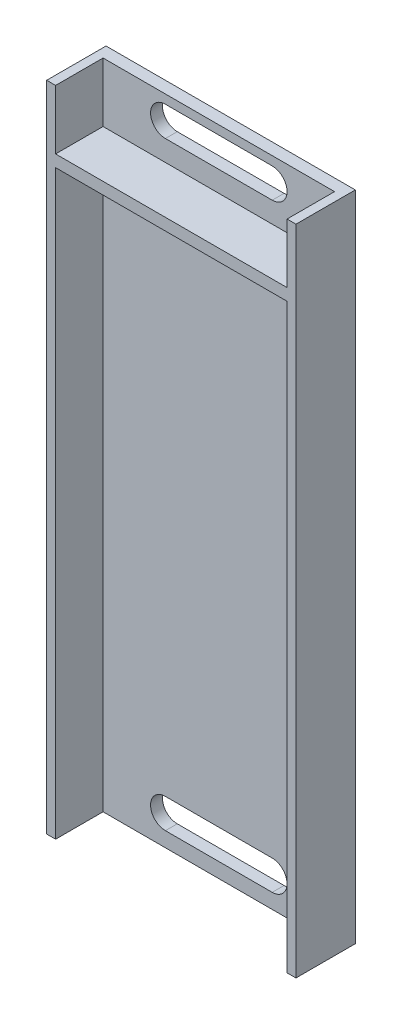
ISO-10303-21;
HEADER;
FILE_DESCRIPTION(('STEP AP214'),'2;1');
FILE_NAME('part.step','',(''),(''),'','','');
FILE_SCHEMA(('AUTOMOTIVE_DESIGN { 1 0 10303 214 1 1 1 1 }'));
ENDSEC;
DATA;
#1=APPLICATION_CONTEXT('core data for automotive mechanical design processes');
#2=APPLICATION_PROTOCOL_DEFINITION('international standard','automotive_design',2000,#1);
#3=PRODUCT_CONTEXT('',#1,'mechanical');
#4=PRODUCT('Part','Part','',(#3));
#5=PRODUCT_RELATED_PRODUCT_CATEGORY('part','',(#4));
#6=PRODUCT_DEFINITION_FORMATION('','',#4);
#7=PRODUCT_DEFINITION_CONTEXT('part definition',#1,'design');
#8=PRODUCT_DEFINITION('design','',#6,#7);
#9=PRODUCT_DEFINITION_SHAPE('','',#8);
#10=(LENGTH_UNIT() NAMED_UNIT(*) SI_UNIT(.MILLI.,.METRE.));
#11=(NAMED_UNIT(*) PLANE_ANGLE_UNIT() SI_UNIT($,.RADIAN.));
#12=(NAMED_UNIT(*) SI_UNIT($,.STERADIAN.) SOLID_ANGLE_UNIT());
#13=UNCERTAINTY_MEASURE_WITH_UNIT(LENGTH_MEASURE(1.E-05),#10,'distance_accuracy_value','');
#14=(GEOMETRIC_REPRESENTATION_CONTEXT(3) GLOBAL_UNCERTAINTY_ASSIGNED_CONTEXT((#13)) GLOBAL_UNIT_ASSIGNED_CONTEXT((#10,
#11,#12)) REPRESENTATION_CONTEXT('',''));
#15=CARTESIAN_POINT('',(0.,0.,0.));
#16=DIRECTION('',(0.,0.,1.));
#17=DIRECTION('',(1.,0.,0.));
#18=AXIS2_PLACEMENT_3D('',#15,#16,#17);
#19=CARTESIAN_POINT('',(-19.5,-55.,1.9));
#20=DIRECTION('',(1.,0.,0.));
#21=DIRECTION('',(0.,1.,0.));
#22=AXIS2_PLACEMENT_3D('',#19,#20,#21);
#23=PLANE('',#22);
#24=DIRECTION('',(0.,0.,1.));
#25=VECTOR('',#24,1.);
#26=CARTESIAN_POINT('',(-19.5,45.,1.9));
#27=LINE('',#26,#25);
#28=CARTESIAN_POINT('',(-19.5,45.,2.));
#29=VERTEX_POINT('',#28);
#30=CARTESIAN_POINT('',(-19.5,45.,10.));
#31=VERTEX_POINT('',#30);
#32=EDGE_CURVE('E337',#29,#31,#27,.T.);
#33=ORIENTED_EDGE('',*,*,#32,.F.);
#34=DIRECTION('',(0.,1.,0.));
#35=VECTOR('',#34,1.);
#36=CARTESIAN_POINT('',(-19.5,-55.,2.));
#37=LINE('',#36,#35);
#38=CARTESIAN_POINT('',(-19.5,55.,2.));
#39=VERTEX_POINT('',#38);
#40=EDGE_CURVE('E278',#29,#39,#37,.T.);
#41=ORIENTED_EDGE('',*,*,#40,.T.);
#42=DIRECTION('',(0.,0.,1.));
#43=VECTOR('',#42,1.);
#44=CARTESIAN_POINT('',(-19.5,55.,1.9));
#45=LINE('',#44,#43);
#46=CARTESIAN_POINT('',(-19.5,55.,10.));
#47=VERTEX_POINT('',#46);
#48=EDGE_CURVE('E322',#39,#47,#45,.T.);
#49=ORIENTED_EDGE('',*,*,#48,.T.);
#50=DIRECTION('',(0.,1.,0.));
#51=VECTOR('',#50,1.);
#52=CARTESIAN_POINT('',(-19.5,-55.,10.));
#53=LINE('',#52,#51);
#54=EDGE_CURVE('E21',#31,#47,#53,.T.);
#55=ORIENTED_EDGE('',*,*,#54,.F.);
#56=EDGE_LOOP('',(#33,#41,#49,#55));
#57=FACE_BOUND('',#56,.T.);
#58=ADVANCED_FACE('F17',(#57),#23,.T.);
#59=CARTESIAN_POINT('',(-19.5,-55.,1.9));
#60=DIRECTION('',(1.,0.,0.));
#61=DIRECTION('',(0.,1.,0.));
#62=AXIS2_PLACEMENT_3D('',#59,#60,#61);
#63=PLANE('',#62);
#64=DIRECTION('',(0.,0.,1.));
#65=VECTOR('',#64,1.);
#66=CARTESIAN_POINT('',(-19.5,-55.,1.9));
#67=LINE('',#66,#65);
#68=CARTESIAN_POINT('',(-19.5,-55.,2.));
#69=VERTEX_POINT('',#68);
#70=CARTESIAN_POINT('',(-19.5,-55.,10.));
#71=VERTEX_POINT('',#70);
#72=EDGE_CURVE('E320',#69,#71,#67,.T.);
#73=ORIENTED_EDGE('',*,*,#72,.F.);
#74=DIRECTION('',(0.,1.,0.));
#75=VECTOR('',#74,1.);
#76=CARTESIAN_POINT('',(-19.5,-55.,2.));
#77=LINE('',#76,#75);
#78=CARTESIAN_POINT('',(-19.5,43.,2.));
#79=VERTEX_POINT('',#78);
#80=EDGE_CURVE('E259',#69,#79,#77,.T.);
#81=ORIENTED_EDGE('',*,*,#80,.T.);
#82=DIRECTION('',(0.,0.,1.));
#83=VECTOR('',#82,1.);
#84=CARTESIAN_POINT('',(-19.5,43.,1.9));
#85=LINE('',#84,#83);
#86=CARTESIAN_POINT('',(-19.5,43.,10.));
#87=VERTEX_POINT('',#86);
#88=EDGE_CURVE('E338',#79,#87,#85,.T.);
#89=ORIENTED_EDGE('',*,*,#88,.T.);
#90=DIRECTION('',(0.,1.,0.));
#91=VECTOR('',#90,1.);
#92=CARTESIAN_POINT('',(-19.5,-55.,10.));
#93=LINE('',#92,#91);
#94=EDGE_CURVE('E230',#71,#87,#93,.T.);
#95=ORIENTED_EDGE('',*,*,#94,.F.);
#96=EDGE_LOOP('',(#73,#81,#89,#95));
#97=FACE_BOUND('',#96,.T.);
#98=ADVANCED_FACE('F19',(#97),#63,.T.);
#99=CARTESIAN_POINT('',(19.5,-55.,1.9));
#100=DIRECTION('',(1.,0.,0.));
#101=DIRECTION('',(0.,1.,0.));
#102=AXIS2_PLACEMENT_3D('',#99,#100,#101);
#103=PLANE('',#102);
#104=DIRECTION('',(0.,1.,0.));
#105=VECTOR('',#104,1.);
#106=CARTESIAN_POINT('',(19.5,-55.,10.));
#107=LINE('',#106,#105);
#108=CARTESIAN_POINT('',(19.5,45.,10.));
#109=VERTEX_POINT('',#108);
#110=CARTESIAN_POINT('',(19.5,55.,10.));
#111=VERTEX_POINT('',#110);
#112=EDGE_CURVE('E233',#109,#111,#107,.T.);
#113=ORIENTED_EDGE('',*,*,#112,.T.);
#114=DIRECTION('',(0.,0.,1.));
#115=VECTOR('',#114,1.);
#116=CARTESIAN_POINT('',(19.5,55.,1.9));
#117=LINE('',#116,#115);
#118=CARTESIAN_POINT('',(19.5,55.,2.));
#119=VERTEX_POINT('',#118);
#120=EDGE_CURVE('E252',#119,#111,#117,.T.);
#121=ORIENTED_EDGE('',*,*,#120,.F.);
#122=DIRECTION('',(0.,1.,0.));
#123=VECTOR('',#122,1.);
#124=CARTESIAN_POINT('',(19.5,-55.,2.));
#125=LINE('',#124,#123);
#126=CARTESIAN_POINT('',(19.5,45.,2.));
#127=VERTEX_POINT('',#126);
#128=EDGE_CURVE('E286',#127,#119,#125,.T.);
#129=ORIENTED_EDGE('',*,*,#128,.F.);
#130=DIRECTION('',(0.,0.,1.));
#131=VECTOR('',#130,1.);
#132=CARTESIAN_POINT('',(19.5,45.,1.9));
#133=LINE('',#132,#131);
#134=EDGE_CURVE('E223',#127,#109,#133,.T.);
#135=ORIENTED_EDGE('',*,*,#134,.T.);
#136=EDGE_LOOP('',(#113,#121,#129,#135));
#137=FACE_BOUND('',#136,.T.);
#138=ADVANCED_FACE('F401',(#137),#103,.F.);
#139=CARTESIAN_POINT('',(-21.,43.,1.9));
#140=DIRECTION('',(0.,1.,0.));
#141=DIRECTION('',(1.,0.,0.));
#142=AXIS2_PLACEMENT_3D('',#139,#140,#141);
#143=PLANE('',#142);
#144=ORIENTED_EDGE('',*,*,#88,.F.);
#145=DIRECTION('',(-1.,0.,0.));
#146=VECTOR('',#145,1.);
#147=CARTESIAN_POINT('',(-21.,43.,2.));
#148=LINE('',#147,#146);
#149=CARTESIAN_POINT('',(19.5,43.,2.));
#150=VERTEX_POINT('',#149);
#151=EDGE_CURVE('E218',#150,#79,#148,.T.);
#152=ORIENTED_EDGE('',*,*,#151,.F.);
#153=DIRECTION('',(0.,0.,1.));
#154=VECTOR('',#153,1.);
#155=CARTESIAN_POINT('',(19.5,43.,1.9));
#156=LINE('',#155,#154);
#157=CARTESIAN_POINT('',(19.5,43.,10.));
#158=VERTEX_POINT('',#157);
#159=EDGE_CURVE('E213',#150,#158,#156,.T.);
#160=ORIENTED_EDGE('',*,*,#159,.T.);
#161=DIRECTION('',(1.,0.,0.));
#162=VECTOR('',#161,1.);
#163=CARTESIAN_POINT('',(-21.,43.,10.));
#164=LINE('',#163,#162);
#165=EDGE_CURVE('E216',#87,#158,#164,.T.);
#166=ORIENTED_EDGE('',*,*,#165,.F.);
#167=EDGE_LOOP('',(#144,#152,#160,#166));
#168=FACE_BOUND('',#167,.T.);
#169=ADVANCED_FACE('F215',(#168),#143,.F.);
#170=CARTESIAN_POINT('',(-21.,45.,1.9));
#171=DIRECTION('',(0.,1.,0.));
#172=DIRECTION('',(1.,0.,0.));
#173=AXIS2_PLACEMENT_3D('',#170,#171,#172);
#174=PLANE('',#173);
#175=DIRECTION('',(1.,0.,0.));
#176=VECTOR('',#175,1.);
#177=CARTESIAN_POINT('',(-21.,45.,10.));
#178=LINE('',#177,#176);
#179=EDGE_CURVE('E234',#31,#109,#178,.T.);
#180=ORIENTED_EDGE('',*,*,#179,.T.);
#181=ORIENTED_EDGE('',*,*,#134,.F.);
#182=DIRECTION('',(-1.,0.,0.));
#183=VECTOR('',#182,1.);
#184=CARTESIAN_POINT('',(-21.,45.,2.));
#185=LINE('',#184,#183);
#186=EDGE_CURVE('E282',#127,#29,#185,.T.);
#187=ORIENTED_EDGE('',*,*,#186,.T.);
#188=ORIENTED_EDGE('',*,*,#32,.T.);
#189=EDGE_LOOP('',(#180,#181,#187,#188));
#190=FACE_BOUND('',#189,.T.);
#191=ADVANCED_FACE('F407',(#190),#174,.T.);
#192=CARTESIAN_POINT('',(19.5,-55.,1.9));
#193=DIRECTION('',(1.,0.,0.));
#194=DIRECTION('',(0.,1.,0.));
#195=AXIS2_PLACEMENT_3D('',#192,#193,#194);
#196=PLANE('',#195);
#197=DIRECTION('',(0.,1.,0.));
#198=VECTOR('',#197,1.);
#199=CARTESIAN_POINT('',(19.5,-55.,10.));
#200=LINE('',#199,#198);
#201=CARTESIAN_POINT('',(19.5,-55.,10.));
#202=VERTEX_POINT('',#201);
#203=EDGE_CURVE('E228',#202,#158,#200,.T.);
#204=ORIENTED_EDGE('',*,*,#203,.T.);
#205=ORIENTED_EDGE('',*,*,#159,.F.);
#206=DIRECTION('',(0.,1.,0.));
#207=VECTOR('',#206,1.);
#208=CARTESIAN_POINT('',(19.5,-55.,2.));
#209=LINE('',#208,#207);
#210=CARTESIAN_POINT('',(19.5,-55.,2.));
#211=VERTEX_POINT('',#210);
#212=EDGE_CURVE('E264',#211,#150,#209,.T.);
#213=ORIENTED_EDGE('',*,*,#212,.F.);
#214=DIRECTION('',(0.,0.,1.));
#215=VECTOR('',#214,1.);
#216=CARTESIAN_POINT('',(19.5,-55.,1.9));
#217=LINE('',#216,#215);
#218=EDGE_CURVE('E238',#211,#202,#217,.T.);
#219=ORIENTED_EDGE('',*,*,#218,.T.);
#220=EDGE_LOOP('',(#204,#205,#213,#219));
#221=FACE_BOUND('',#220,.T.);
#222=ADVANCED_FACE('F236',(#221),#196,.F.);
#223=CARTESIAN_POINT('',(-9.,48.5,-1.));
#224=DIRECTION('',(0.,1.,0.));
#225=DIRECTION('',(1.,0.,0.));
#226=AXIS2_PLACEMENT_3D('',#223,#224,#225);
#227=PLANE('',#226);
#228=DIRECTION('',(-1.,0.,0.));
#229=VECTOR('',#228,1.);
#230=CARTESIAN_POINT('',(-15.,48.5,0.));
#231=LINE('',#230,#229);
#232=CARTESIAN_POINT('',(9.,48.5,0.));
#233=VERTEX_POINT('',#232);
#234=CARTESIAN_POINT('',(-9.,48.5,0.));
#235=VERTEX_POINT('',#234);
#236=EDGE_CURVE('E388',#233,#235,#231,.T.);
#237=ORIENTED_EDGE('',*,*,#236,.T.);
#238=DIRECTION('',(0.,0.,1.));
#239=VECTOR('',#238,1.);
#240=CARTESIAN_POINT('',(-9.,48.5,-1.));
#241=LINE('',#240,#239);
#242=CARTESIAN_POINT('',(-9.,48.5,2.));
#243=VERTEX_POINT('',#242);
#244=EDGE_CURVE('E76',#235,#243,#241,.T.);
#245=ORIENTED_EDGE('',*,*,#244,.T.);
#246=DIRECTION('',(-1.,0.,0.));
#247=VECTOR('',#246,1.);
#248=CARTESIAN_POINT('',(-15.,48.5,2.));
#249=LINE('',#248,#247);
#250=CARTESIAN_POINT('',(9.,48.5,2.));
#251=VERTEX_POINT('',#250);
#252=EDGE_CURVE('E293',#251,#243,#249,.T.);
#253=ORIENTED_EDGE('',*,*,#252,.F.);
#254=DIRECTION('',(0.,0.,1.));
#255=VECTOR('',#254,1.);
#256=CARTESIAN_POINT('',(9.,48.5,-1.));
#257=LINE('',#256,#255);
#258=EDGE_CURVE('E314',#233,#251,#257,.T.);
#259=ORIENTED_EDGE('',*,*,#258,.F.);
#260=EDGE_LOOP('',(#237,#245,#253,#259));
#261=FACE_BOUND('',#260,.T.);
#262=ADVANCED_FACE('F611',(#261),#227,.T.);
#263=CARTESIAN_POINT('',(-9.,51.,-1.));
#264=DIRECTION('',(0.,0.,-1.));
#265=DIRECTION('',(0.,1.,0.));
#266=AXIS2_PLACEMENT_3D('',#263,#264,#265);
#267=CYLINDRICAL_SURFACE('',#266,2.5);
#268=CARTESIAN_POINT('',(-9.,51.,0.));
#269=DIRECTION('',(0.,0.,-1.));
#270=DIRECTION('',(0.,1.,0.));
#271=AXIS2_PLACEMENT_3D('',#268,#269,#270);
#272=CIRCLE('',#271,2.5);
#273=CARTESIAN_POINT('',(-9.,53.5,0.));
#274=VERTEX_POINT('',#273);
#275=EDGE_CURVE('E385',#235,#274,#272,.T.);
#276=ORIENTED_EDGE('',*,*,#275,.T.);
#277=DIRECTION('',(0.,0.,1.));
#278=VECTOR('',#277,1.);
#279=CARTESIAN_POINT('',(-9.,53.5,-1.));
#280=LINE('',#279,#278);
#281=CARTESIAN_POINT('',(-9.,53.5,2.));
#282=VERTEX_POINT('',#281);
#283=EDGE_CURVE('E66',#274,#282,#280,.T.);
#284=ORIENTED_EDGE('',*,*,#283,.T.);
#285=CARTESIAN_POINT('',(-9.,51.,2.));
#286=DIRECTION('',(0.,0.,-1.));
#287=DIRECTION('',(0.,1.,0.));
#288=AXIS2_PLACEMENT_3D('',#285,#286,#287);
#289=CIRCLE('',#288,2.5);
#290=EDGE_CURVE('E297',#243,#282,#289,.T.);
#291=ORIENTED_EDGE('',*,*,#290,.F.);
#292=ORIENTED_EDGE('',*,*,#244,.F.);
#293=EDGE_LOOP('',(#276,#284,#291,#292));
#294=FACE_BOUND('',#293,.T.);
#295=ADVANCED_FACE('F601',(#294),#267,.F.);
#296=CARTESIAN_POINT('',(9.,53.5,-1.));
#297=DIRECTION('',(0.,-1.,0.));
#298=DIRECTION('',(0.,0.,-1.));
#299=AXIS2_PLACEMENT_3D('',#296,#297,#298);
#300=PLANE('',#299);
#301=DIRECTION('',(1.,0.,0.));
#302=VECTOR('',#301,1.);
#303=CARTESIAN_POINT('',(-6.,53.5,0.));
#304=LINE('',#303,#302);
#305=CARTESIAN_POINT('',(9.,53.5,0.));
#306=VERTEX_POINT('',#305);
#307=EDGE_CURVE('E378',#274,#306,#304,.T.);
#308=ORIENTED_EDGE('',*,*,#307,.T.);
#309=DIRECTION('',(0.,0.,1.));
#310=VECTOR('',#309,1.);
#311=CARTESIAN_POINT('',(9.,53.5,-1.));
#312=LINE('',#311,#310);
#313=CARTESIAN_POINT('',(9.,53.5,2.));
#314=VERTEX_POINT('',#313);
#315=EDGE_CURVE('E289',#306,#314,#312,.T.);
#316=ORIENTED_EDGE('',*,*,#315,.T.);
#317=DIRECTION('',(1.,0.,0.));
#318=VECTOR('',#317,1.);
#319=CARTESIAN_POINT('',(-6.,53.5,2.));
#320=LINE('',#319,#318);
#321=EDGE_CURVE('E298',#282,#314,#320,.T.);
#322=ORIENTED_EDGE('',*,*,#321,.F.);
#323=ORIENTED_EDGE('',*,*,#283,.F.);
#324=EDGE_LOOP('',(#308,#316,#322,#323));
#325=FACE_BOUND('',#324,.T.);
#326=ADVANCED_FACE('F590',(#325),#300,.T.);
#327=CARTESIAN_POINT('',(9.,51.,-1.));
#328=DIRECTION('',(0.,0.,-1.));
#329=DIRECTION('',(0.,-1.,0.));
#330=AXIS2_PLACEMENT_3D('',#327,#328,#329);
#331=CYLINDRICAL_SURFACE('',#330,2.5);
#332=CARTESIAN_POINT('',(9.,51.,0.));
#333=DIRECTION('',(0.,0.,-1.));
#334=DIRECTION('',(0.,-1.,0.));
#335=AXIS2_PLACEMENT_3D('',#332,#333,#334);
#336=CIRCLE('',#335,2.5);
#337=EDGE_CURVE('E391',#306,#233,#336,.T.);
#338=ORIENTED_EDGE('',*,*,#337,.T.);
#339=ORIENTED_EDGE('',*,*,#258,.T.);
#340=CARTESIAN_POINT('',(9.,51.,2.));
#341=DIRECTION('',(0.,0.,-1.));
#342=DIRECTION('',(0.,-1.,0.));
#343=AXIS2_PLACEMENT_3D('',#340,#341,#342);
#344=CIRCLE('',#343,2.5);
#345=EDGE_CURVE('E292',#314,#251,#344,.T.);
#346=ORIENTED_EDGE('',*,*,#345,.F.);
#347=ORIENTED_EDGE('',*,*,#315,.F.);
#348=EDGE_LOOP('',(#338,#339,#346,#347));
#349=FACE_BOUND('',#348,.T.);
#350=ADVANCED_FACE('F580',(#349),#331,.F.);
#351=CARTESIAN_POINT('',(-9.,-50.,-1.));
#352=DIRECTION('',(0.,0.,-1.));
#353=DIRECTION('',(0.,1.,0.));
#354=AXIS2_PLACEMENT_3D('',#351,#352,#353);
#355=CYLINDRICAL_SURFACE('',#354,2.5);
#356=CARTESIAN_POINT('',(-9.,-50.,0.));
#357=DIRECTION('',(0.,0.,-1.));
#358=DIRECTION('',(0.,1.,0.));
#359=AXIS2_PLACEMENT_3D('',#356,#357,#358);
#360=CIRCLE('',#359,2.5);
#361=CARTESIAN_POINT('',(-9.,-52.5,0.));
#362=VERTEX_POINT('',#361);
#363=CARTESIAN_POINT('',(-9.,-47.5,0.));
#364=VERTEX_POINT('',#363);
#365=EDGE_CURVE('E369',#362,#364,#360,.T.);
#366=ORIENTED_EDGE('',*,*,#365,.T.);
#367=DIRECTION('',(0.,0.,1.));
#368=VECTOR('',#367,1.);
#369=CARTESIAN_POINT('',(-9.,-47.5,-1.));
#370=LINE('',#369,#368);
#371=CARTESIAN_POINT('',(-9.,-47.5,2.));
#372=VERTEX_POINT('',#371);
#373=EDGE_CURVE('E308',#364,#372,#370,.T.);
#374=ORIENTED_EDGE('',*,*,#373,.T.);
#375=CARTESIAN_POINT('',(-9.,-50.,2.));
#376=DIRECTION('',(0.,0.,-1.));
#377=DIRECTION('',(0.,1.,0.));
#378=AXIS2_PLACEMENT_3D('',#375,#376,#377);
#379=CIRCLE('',#378,2.5);
#380=CARTESIAN_POINT('',(-9.,-52.5,2.));
#381=VERTEX_POINT('',#380);
#382=EDGE_CURVE('E273',#381,#372,#379,.T.);
#383=ORIENTED_EDGE('',*,*,#382,.F.);
#384=DIRECTION('',(0.,0.,1.));
#385=VECTOR('',#384,1.);
#386=CARTESIAN_POINT('',(-9.,-52.5,-1.));
#387=LINE('',#386,#385);
#388=EDGE_CURVE('E311',#362,#381,#387,.T.);
#389=ORIENTED_EDGE('',*,*,#388,.F.);
#390=EDGE_LOOP('',(#366,#374,#383,#389));
#391=FACE_BOUND('',#390,.T.);
#392=ADVANCED_FACE('F570',(#391),#355,.F.);
#393=CARTESIAN_POINT('',(-9.,-52.5,-1.));
#394=DIRECTION('',(0.,1.,0.));
#395=DIRECTION('',(1.,0.,0.));
#396=AXIS2_PLACEMENT_3D('',#393,#394,#395);
#397=PLANE('',#396);
#398=DIRECTION('',(-1.,0.,0.));
#399=VECTOR('',#398,1.);
#400=CARTESIAN_POINT('',(-15.,-52.5,0.));
#401=LINE('',#400,#399);
#402=CARTESIAN_POINT('',(9.,-52.5,0.));
#403=VERTEX_POINT('',#402);
#404=EDGE_CURVE('E373',#403,#362,#401,.T.);
#405=ORIENTED_EDGE('',*,*,#404,.T.);
#406=ORIENTED_EDGE('',*,*,#388,.T.);
#407=DIRECTION('',(-1.,0.,0.));
#408=VECTOR('',#407,1.);
#409=CARTESIAN_POINT('',(-15.,-52.5,2.));
#410=LINE('',#409,#408);
#411=CARTESIAN_POINT('',(9.,-52.5,2.));
#412=VERTEX_POINT('',#411);
#413=EDGE_CURVE('E269',#412,#381,#410,.T.);
#414=ORIENTED_EDGE('',*,*,#413,.F.);
#415=DIRECTION('',(0.,0.,1.));
#416=VECTOR('',#415,1.);
#417=CARTESIAN_POINT('',(9.,-52.5,-1.));
#418=LINE('',#417,#416);
#419=EDGE_CURVE('E302',#403,#412,#418,.T.);
#420=ORIENTED_EDGE('',*,*,#419,.F.);
#421=EDGE_LOOP('',(#405,#406,#414,#420));
#422=FACE_BOUND('',#421,.T.);
#423=ADVANCED_FACE('F560',(#422),#397,.T.);
#424=CARTESIAN_POINT('',(9.,-47.5,-1.));
#425=DIRECTION('',(0.,-1.,0.));
#426=DIRECTION('',(0.,0.,-1.));
#427=AXIS2_PLACEMENT_3D('',#424,#425,#426);
#428=PLANE('',#427);
#429=DIRECTION('',(1.,0.,0.));
#430=VECTOR('',#429,1.);
#431=CARTESIAN_POINT('',(-6.,-47.5,0.));
#432=LINE('',#431,#430);
#433=CARTESIAN_POINT('',(9.,-47.5,0.));
#434=VERTEX_POINT('',#433);
#435=EDGE_CURVE('E368',#364,#434,#432,.T.);
#436=ORIENTED_EDGE('',*,*,#435,.T.);
#437=DIRECTION('',(0.,0.,1.));
#438=VECTOR('',#437,1.);
#439=CARTESIAN_POINT('',(9.,-47.5,-1.));
#440=LINE('',#439,#438);
#441=CARTESIAN_POINT('',(9.,-47.5,2.));
#442=VERTEX_POINT('',#441);
#443=EDGE_CURVE('E305',#434,#442,#440,.T.);
#444=ORIENTED_EDGE('',*,*,#443,.T.);
#445=DIRECTION('',(1.,0.,0.));
#446=VECTOR('',#445,1.);
#447=CARTESIAN_POINT('',(-6.,-47.5,2.));
#448=LINE('',#447,#446);
#449=EDGE_CURVE('E277',#372,#442,#448,.T.);
#450=ORIENTED_EDGE('',*,*,#449,.F.);
#451=ORIENTED_EDGE('',*,*,#373,.F.);
#452=EDGE_LOOP('',(#436,#444,#450,#451));
#453=FACE_BOUND('',#452,.T.);
#454=ADVANCED_FACE('F550',(#453),#428,.T.);
#455=CARTESIAN_POINT('',(9.,-50.,-1.));
#456=DIRECTION('',(0.,0.,-1.));
#457=DIRECTION('',(0.,-1.,0.));
#458=AXIS2_PLACEMENT_3D('',#455,#456,#457);
#459=CYLINDRICAL_SURFACE('',#458,2.5);
#460=CARTESIAN_POINT('',(9.,-50.,0.));
#461=DIRECTION('',(0.,0.,-1.));
#462=DIRECTION('',(0.,-1.,0.));
#463=AXIS2_PLACEMENT_3D('',#460,#461,#462);
#464=CIRCLE('',#463,2.5);
#465=EDGE_CURVE('E374',#434,#403,#464,.T.);
#466=ORIENTED_EDGE('',*,*,#465,.T.);
#467=ORIENTED_EDGE('',*,*,#419,.T.);
#468=CARTESIAN_POINT('',(9.,-50.,2.));
#469=DIRECTION('',(0.,0.,-1.));
#470=DIRECTION('',(0.,-1.,0.));
#471=AXIS2_PLACEMENT_3D('',#468,#469,#470);
#472=CIRCLE('',#471,2.5);
#473=EDGE_CURVE('E265',#442,#412,#472,.T.);
#474=ORIENTED_EDGE('',*,*,#473,.F.);
#475=ORIENTED_EDGE('',*,*,#443,.F.);
#476=EDGE_LOOP('',(#466,#467,#474,#475));
#477=FACE_BOUND('',#476,.T.);
#478=ADVANCED_FACE('F540',(#477),#459,.F.);
#479=CARTESIAN_POINT('',(-21.,-55.,2.));
#480=DIRECTION('',(0.,0.,1.));
#481=DIRECTION('',(1.,0.,0.));
#482=AXIS2_PLACEMENT_3D('',#479,#480,#481);
#483=PLANE('',#482);
#484=ORIENTED_EDGE('',*,*,#345,.T.);
#485=ORIENTED_EDGE('',*,*,#252,.T.);
#486=ORIENTED_EDGE('',*,*,#290,.T.);
#487=ORIENTED_EDGE('',*,*,#321,.T.);
#488=EDGE_LOOP('',(#484,#485,#486,#487));
#489=FACE_BOUND('',#488,.T.);
#490=DIRECTION('',(1.,0.,0.));
#491=VECTOR('',#490,1.);
#492=CARTESIAN_POINT('',(-21.,55.,2.));
#493=LINE('',#492,#491);
#494=EDGE_CURVE('E361',#39,#119,#493,.T.);
#495=ORIENTED_EDGE('',*,*,#494,.F.);
#496=ORIENTED_EDGE('',*,*,#40,.F.);
#497=ORIENTED_EDGE('',*,*,#186,.F.);
#498=ORIENTED_EDGE('',*,*,#128,.T.);
#499=EDGE_LOOP('',(#495,#496,#497,#498));
#500=FACE_BOUND('',#499,.T.);
#501=ADVANCED_FACE('F528',(#489,#500),#483,.T.);
#502=CARTESIAN_POINT('',(-21.,-55.,0.));
#503=DIRECTION('',(1.,0.,0.));
#504=DIRECTION('',(0.,1.,0.));
#505=AXIS2_PLACEMENT_3D('',#502,#503,#504);
#506=PLANE('',#505);
#507=DIRECTION('',(0.,0.,1.));
#508=VECTOR('',#507,1.);
#509=CARTESIAN_POINT('',(-21.,-55.,0.));
#510=LINE('',#509,#508);
#511=CARTESIAN_POINT('',(-21.,-55.,0.));
#512=VERTEX_POINT('',#511);
#513=CARTESIAN_POINT('',(-21.,-55.,10.));
#514=VERTEX_POINT('',#513);
#515=EDGE_CURVE('E353',#512,#514,#510,.T.);
#516=ORIENTED_EDGE('',*,*,#515,.T.);
#517=DIRECTION('',(0.,1.,0.));
#518=VECTOR('',#517,1.);
#519=CARTESIAN_POINT('',(-21.,43.,10.));
#520=LINE('',#519,#518);
#521=CARTESIAN_POINT('',(-21.,55.,10.));
#522=VERTEX_POINT('',#521);
#523=EDGE_CURVE('E341',#514,#522,#520,.T.);
#524=ORIENTED_EDGE('',*,*,#523,.T.);
#525=DIRECTION('',(0.,0.,1.));
#526=VECTOR('',#525,1.);
#527=CARTESIAN_POINT('',(-21.,55.,0.));
#528=LINE('',#527,#526);
#529=CARTESIAN_POINT('',(-21.,55.,0.));
#530=VERTEX_POINT('',#529);
#531=EDGE_CURVE('E40',#530,#522,#528,.T.);
#532=ORIENTED_EDGE('',*,*,#531,.F.);
#533=DIRECTION('',(0.,1.,0.));
#534=VECTOR('',#533,1.);
#535=CARTESIAN_POINT('',(-21.,-55.,0.));
#536=LINE('',#535,#534);
#537=EDGE_CURVE('E365',#512,#530,#536,.T.);
#538=ORIENTED_EDGE('',*,*,#537,.F.);
#539=EDGE_LOOP('',(#516,#524,#532,#538));
#540=FACE_BOUND('',#539,.T.);
#541=ADVANCED_FACE('F517',(#540),#506,.F.);
#542=CARTESIAN_POINT('',(-21.,-55.,2.));
#543=DIRECTION('',(0.,0.,1.));
#544=DIRECTION('',(1.,0.,0.));
#545=AXIS2_PLACEMENT_3D('',#542,#543,#544);
#546=PLANE('',#545);
#547=ORIENTED_EDGE('',*,*,#473,.T.);
#548=ORIENTED_EDGE('',*,*,#413,.T.);
#549=ORIENTED_EDGE('',*,*,#382,.T.);
#550=ORIENTED_EDGE('',*,*,#449,.T.);
#551=EDGE_LOOP('',(#547,#548,#549,#550));
#552=FACE_BOUND('',#551,.T.);
#553=ORIENTED_EDGE('',*,*,#151,.T.);
#554=ORIENTED_EDGE('',*,*,#80,.F.);
#555=DIRECTION('',(1.,0.,0.));
#556=VECTOR('',#555,1.);
#557=CARTESIAN_POINT('',(-21.,-55.,2.));
#558=LINE('',#557,#556);
#559=EDGE_CURVE('E354',#69,#211,#558,.T.);
#560=ORIENTED_EDGE('',*,*,#559,.T.);
#561=ORIENTED_EDGE('',*,*,#212,.T.);
#562=EDGE_LOOP('',(#553,#554,#560,#561));
#563=FACE_BOUND('',#562,.T.);
#564=ADVANCED_FACE('F506',(#552,#563),#546,.T.);
#565=CARTESIAN_POINT('',(-21.,-55.,0.));
#566=DIRECTION('',(0.,0.,1.));
#567=DIRECTION('',(1.,0.,0.));
#568=AXIS2_PLACEMENT_3D('',#565,#566,#567);
#569=PLANE('',#568);
#570=ORIENTED_EDGE('',*,*,#307,.F.);
#571=ORIENTED_EDGE('',*,*,#275,.F.);
#572=ORIENTED_EDGE('',*,*,#236,.F.);
#573=ORIENTED_EDGE('',*,*,#337,.F.);
#574=EDGE_LOOP('',(#570,#571,#572,#573));
#575=FACE_BOUND('',#574,.T.);
#576=ORIENTED_EDGE('',*,*,#435,.F.);
#577=ORIENTED_EDGE('',*,*,#365,.F.);
#578=ORIENTED_EDGE('',*,*,#404,.F.);
#579=ORIENTED_EDGE('',*,*,#465,.F.);
#580=EDGE_LOOP('',(#576,#577,#578,#579));
#581=FACE_BOUND('',#580,.T.);
#582=DIRECTION('',(1.,0.,0.));
#583=VECTOR('',#582,1.);
#584=CARTESIAN_POINT('',(-21.,55.,0.));
#585=LINE('',#584,#583);
#586=CARTESIAN_POINT('',(21.,55.,0.));
#587=VERTEX_POINT('',#586);
#588=EDGE_CURVE('E342',#530,#587,#585,.T.);
#589=ORIENTED_EDGE('',*,*,#588,.T.);
#590=DIRECTION('',(0.,1.,0.));
#591=VECTOR('',#590,1.);
#592=CARTESIAN_POINT('',(21.,-55.,0.));
#593=LINE('',#592,#591);
#594=CARTESIAN_POINT('',(21.,-55.,0.));
#595=VERTEX_POINT('',#594);
#596=EDGE_CURVE('E358',#595,#587,#593,.T.);
#597=ORIENTED_EDGE('',*,*,#596,.F.);
#598=DIRECTION('',(1.,0.,0.));
#599=VECTOR('',#598,1.);
#600=CARTESIAN_POINT('',(-21.,-55.,0.));
#601=LINE('',#600,#599);
#602=EDGE_CURVE('E346',#512,#595,#601,.T.);
#603=ORIENTED_EDGE('',*,*,#602,.F.);
#604=ORIENTED_EDGE('',*,*,#537,.T.);
#605=EDGE_LOOP('',(#589,#597,#603,#604));
#606=FACE_BOUND('',#605,.T.);
#607=ADVANCED_FACE('F495',(#575,#581,#606),#569,.F.);
#608=CARTESIAN_POINT('',(-21.,55.,0.));
#609=DIRECTION('',(0.,1.,0.));
#610=DIRECTION('',(1.,0.,0.));
#611=AXIS2_PLACEMENT_3D('',#608,#609,#610);
#612=PLANE('',#611);
#613=DIRECTION('',(0.,0.,1.));
#614=VECTOR('',#613,1.);
#615=CARTESIAN_POINT('',(21.,55.,0.));
#616=LINE('',#615,#614);
#617=CARTESIAN_POINT('',(21.,55.,10.));
#618=VERTEX_POINT('',#617);
#619=EDGE_CURVE('E428',#587,#618,#616,.T.);
#620=ORIENTED_EDGE('',*,*,#619,.F.);
#621=ORIENTED_EDGE('',*,*,#588,.F.);
#622=ORIENTED_EDGE('',*,*,#531,.T.);
#623=DIRECTION('',(1.,0.,0.));
#624=VECTOR('',#623,1.);
#625=CARTESIAN_POINT('',(-21.,55.,10.));
#626=LINE('',#625,#624);
#627=EDGE_CURVE('E11',#522,#47,#626,.T.);
#628=ORIENTED_EDGE('',*,*,#627,.T.);
#629=ORIENTED_EDGE('',*,*,#48,.F.);
#630=ORIENTED_EDGE('',*,*,#494,.T.);
#631=ORIENTED_EDGE('',*,*,#120,.T.);
#632=DIRECTION('',(1.,0.,0.));
#633=VECTOR('',#632,1.);
#634=CARTESIAN_POINT('',(19.5,55.,10.));
#635=LINE('',#634,#633);
#636=EDGE_CURVE('E253',#111,#618,#635,.T.);
#637=ORIENTED_EDGE('',*,*,#636,.T.);
#638=EDGE_LOOP('',(#620,#621,#622,#628,#629,#630,#631,#637));
#639=FACE_BOUND('',#638,.T.);
#640=ADVANCED_FACE('F484',(#639),#612,.T.);
#641=CARTESIAN_POINT('',(19.5,-55.,10.));
#642=DIRECTION('',(0.,0.,1.));
#643=DIRECTION('',(1.,0.,0.));
#644=AXIS2_PLACEMENT_3D('',#641,#642,#643);
#645=PLANE('',#644);
#646=ORIENTED_EDGE('',*,*,#112,.F.);
#647=ORIENTED_EDGE('',*,*,#179,.F.);
#648=ORIENTED_EDGE('',*,*,#54,.T.);
#649=ORIENTED_EDGE('',*,*,#627,.F.);
#650=ORIENTED_EDGE('',*,*,#523,.F.);
#651=DIRECTION('',(1.,0.,0.));
#652=VECTOR('',#651,1.);
#653=CARTESIAN_POINT('',(-21.,-55.,10.));
#654=LINE('',#653,#652);
#655=EDGE_CURVE('E55',#514,#71,#654,.T.);
#656=ORIENTED_EDGE('',*,*,#655,.T.);
#657=ORIENTED_EDGE('',*,*,#94,.T.);
#658=ORIENTED_EDGE('',*,*,#165,.T.);
#659=ORIENTED_EDGE('',*,*,#203,.F.);
#660=DIRECTION('',(1.,0.,0.));
#661=VECTOR('',#660,1.);
#662=CARTESIAN_POINT('',(19.5,-55.,10.));
#663=LINE('',#662,#661);
#664=CARTESIAN_POINT('',(21.,-55.,10.));
#665=VERTEX_POINT('',#664);
#666=EDGE_CURVE('E248',#202,#665,#663,.T.);
#667=ORIENTED_EDGE('',*,*,#666,.T.);
#668=DIRECTION('',(0.,1.,0.));
#669=VECTOR('',#668,1.);
#670=CARTESIAN_POINT('',(21.,43.,10.));
#671=LINE('',#670,#669);
#672=EDGE_CURVE('E417',#665,#618,#671,.T.);
#673=ORIENTED_EDGE('',*,*,#672,.T.);
#674=ORIENTED_EDGE('',*,*,#636,.F.);
#675=EDGE_LOOP('',(#646,#647,#648,#649,#650,#656,#657,#658,#659,#667,#673,#674));
#676=FACE_BOUND('',#675,.T.);
#677=ADVANCED_FACE('F226',(#676),#645,.T.);
#678=CARTESIAN_POINT('',(-21.,-55.,0.));
#679=DIRECTION('',(0.,1.,0.));
#680=DIRECTION('',(1.,0.,0.));
#681=AXIS2_PLACEMENT_3D('',#678,#679,#680);
#682=PLANE('',#681);
#683=DIRECTION('',(0.,0.,1.));
#684=VECTOR('',#683,1.);
#685=CARTESIAN_POINT('',(21.,-55.,0.));
#686=LINE('',#685,#684);
#687=EDGE_CURVE('E672',#595,#665,#686,.T.);
#688=ORIENTED_EDGE('',*,*,#687,.T.);
#689=ORIENTED_EDGE('',*,*,#666,.F.);
#690=ORIENTED_EDGE('',*,*,#218,.F.);
#691=ORIENTED_EDGE('',*,*,#559,.F.);
#692=ORIENTED_EDGE('',*,*,#72,.T.);
#693=ORIENTED_EDGE('',*,*,#655,.F.);
#694=ORIENTED_EDGE('',*,*,#515,.F.);
#695=ORIENTED_EDGE('',*,*,#602,.T.);
#696=EDGE_LOOP('',(#688,#689,#690,#691,#692,#693,#694,#695));
#697=FACE_BOUND('',#696,.T.);
#698=ADVANCED_FACE('F455',(#697),#682,.F.);
#699=CARTESIAN_POINT('',(21.,-55.,0.));
#700=DIRECTION('',(1.,0.,0.));
#701=DIRECTION('',(0.,1.,0.));
#702=AXIS2_PLACEMENT_3D('',#699,#700,#701);
#703=PLANE('',#702);
#704=ORIENTED_EDGE('',*,*,#687,.F.);
#705=ORIENTED_EDGE('',*,*,#596,.T.);
#706=ORIENTED_EDGE('',*,*,#619,.T.);
#707=ORIENTED_EDGE('',*,*,#672,.F.);
#708=EDGE_LOOP('',(#704,#705,#706,#707));
#709=FACE_BOUND('',#708,.T.);
#710=ADVANCED_FACE('F450',(#709),#703,.T.);
#711=CLOSED_SHELL('',(#58,#98,#138,#169,#191,#222,#262,#295,#326,#350,#392,#423,#454,#478,#501,
#541,#564,#607,#640,#677,#698,#710));
#712=MANIFOLD_SOLID_BREP('B1',#711);
#713=ADVANCED_BREP_SHAPE_REPRESENTATION('',(#18,#712),#14);
#714=SHAPE_DEFINITION_REPRESENTATION(#9,#713);
ENDSEC;
END-ISO-10303-21;
